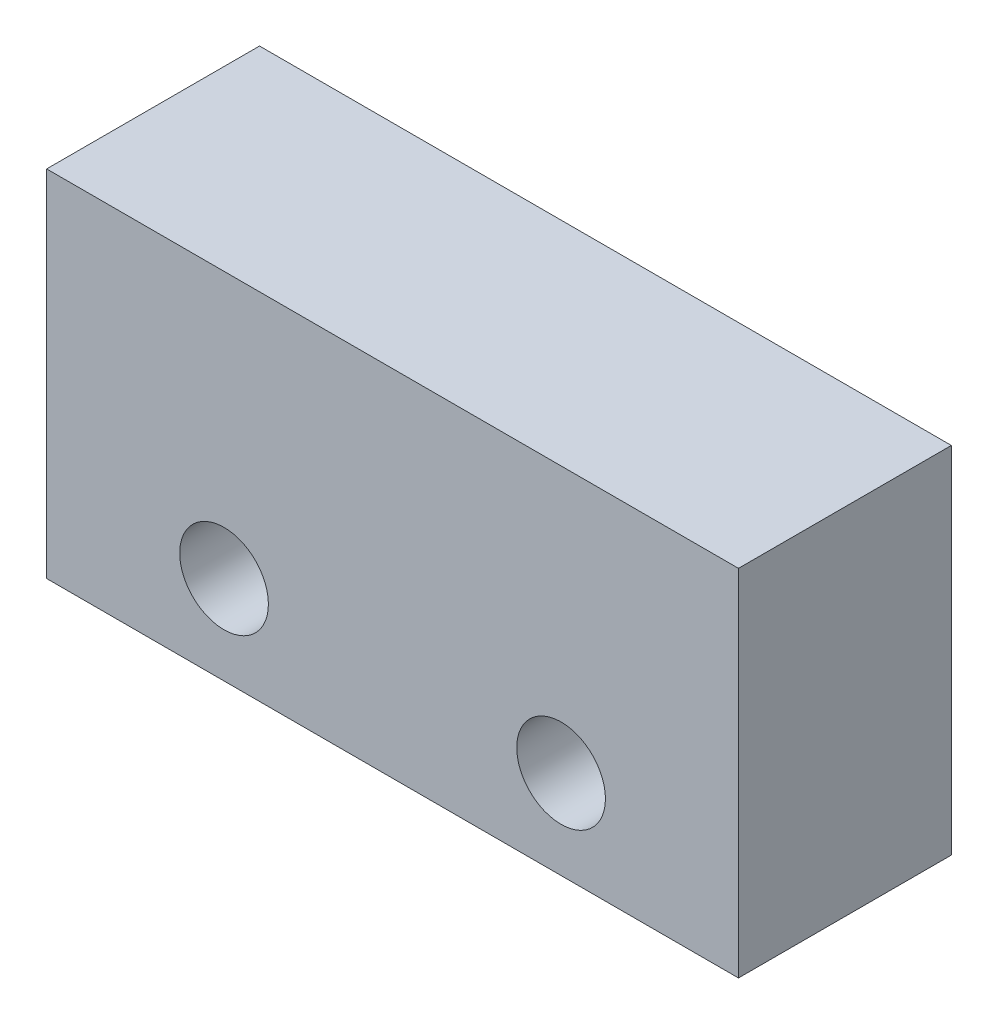
ISO-10303-21;
HEADER;
FILE_DESCRIPTION(('STEP AP214'),'2;1');
FILE_NAME('part.step','',(''),(''),'','','');
FILE_SCHEMA(('AUTOMOTIVE_DESIGN { 1 0 10303 214 1 1 1 1 }'));
ENDSEC;
DATA;
#1=APPLICATION_CONTEXT('core data for automotive mechanical design processes');
#2=APPLICATION_PROTOCOL_DEFINITION('international standard','automotive_design',2000,#1);
#3=PRODUCT_CONTEXT('',#1,'mechanical');
#4=PRODUCT('Part','Part','',(#3));
#5=PRODUCT_RELATED_PRODUCT_CATEGORY('part','',(#4));
#6=PRODUCT_DEFINITION_FORMATION('','',#4);
#7=PRODUCT_DEFINITION_CONTEXT('part definition',#1,'design');
#8=PRODUCT_DEFINITION('design','',#6,#7);
#9=PRODUCT_DEFINITION_SHAPE('','',#8);
#10=(LENGTH_UNIT() NAMED_UNIT(*) SI_UNIT(.MILLI.,.METRE.));
#11=(NAMED_UNIT(*) PLANE_ANGLE_UNIT() SI_UNIT($,.RADIAN.));
#12=(NAMED_UNIT(*) SI_UNIT($,.STERADIAN.) SOLID_ANGLE_UNIT());
#13=UNCERTAINTY_MEASURE_WITH_UNIT(LENGTH_MEASURE(1.E-05),#10,'distance_accuracy_value','');
#14=(GEOMETRIC_REPRESENTATION_CONTEXT(3) GLOBAL_UNCERTAINTY_ASSIGNED_CONTEXT((#13)) GLOBAL_UNIT_ASSIGNED_CONTEXT((#10,
#11,#12)) REPRESENTATION_CONTEXT('',''));
#15=CARTESIAN_POINT('',(0.,0.,0.));
#16=DIRECTION('',(0.,0.,1.));
#17=DIRECTION('',(1.,0.,0.));
#18=AXIS2_PLACEMENT_3D('',#15,#16,#17);
#19=CARTESIAN_POINT('',(0.,0.,3.));
#20=DIRECTION('',(0.,0.,-1.));
#21=DIRECTION('',(-1.,0.,0.));
#22=AXIS2_PLACEMENT_3D('',#19,#20,#21);
#23=PLANE('',#22);
#24=DIRECTION('',(0.,1.,0.));
#25=VECTOR('',#24,1.);
#26=CARTESIAN_POINT('',(9.75,-5.,3.));
#27=LINE('',#26,#25);
#28=CARTESIAN_POINT('',(9.75,-5.,3.));
#29=VERTEX_POINT('',#28);
#30=CARTESIAN_POINT('',(9.75,5.,3.));
#31=VERTEX_POINT('',#30);
#32=EDGE_CURVE('E98',#29,#31,#27,.T.);
#33=ORIENTED_EDGE('',*,*,#32,.T.);
#34=DIRECTION('',(-1.,0.,0.));
#35=VECTOR('',#34,1.);
#36=CARTESIAN_POINT('',(-9.75,5.,3.));
#37=LINE('',#36,#35);
#38=CARTESIAN_POINT('',(-9.75,5.,3.));
#39=VERTEX_POINT('',#38);
#40=EDGE_CURVE('E93',#31,#39,#37,.T.);
#41=ORIENTED_EDGE('',*,*,#40,.T.);
#42=DIRECTION('',(0.,-1.,0.));
#43=VECTOR('',#42,1.);
#44=CARTESIAN_POINT('',(-9.75,-5.,3.));
#45=LINE('',#44,#43);
#46=CARTESIAN_POINT('',(-9.75,-5.,3.));
#47=VERTEX_POINT('',#46);
#48=EDGE_CURVE('E96',#39,#47,#45,.T.);
#49=ORIENTED_EDGE('',*,*,#48,.T.);
#50=DIRECTION('',(1.,0.,0.));
#51=VECTOR('',#50,1.);
#52=CARTESIAN_POINT('',(-9.75,-5.,3.));
#53=LINE('',#52,#51);
#54=EDGE_CURVE('E63',#47,#29,#53,.T.);
#55=ORIENTED_EDGE('',*,*,#54,.T.);
#56=EDGE_LOOP('',(#33,#41,#49,#55));
#57=FACE_BOUND('',#56,.T.);
#58=CARTESIAN_POINT('',(-4.75,-2.5,3.));
#59=DIRECTION('',(0.,0.,1.));
#60=DIRECTION('',(1.,0.,0.));
#61=AXIS2_PLACEMENT_3D('',#58,#59,#60);
#62=CIRCLE('',#61,1.25);
#63=CARTESIAN_POINT('',(-3.5,-2.5,3.));
#64=VERTEX_POINT('',#63);
#65=EDGE_CURVE('E118',#64,#64,#62,.T.);
#66=ORIENTED_EDGE('',*,*,#65,.F.);
#67=EDGE_LOOP('',(#66));
#68=FACE_BOUND('',#67,.T.);
#69=CARTESIAN_POINT('',(4.75,-2.5,3.));
#70=DIRECTION('',(0.,0.,1.));
#71=DIRECTION('',(1.,0.,0.));
#72=AXIS2_PLACEMENT_3D('',#69,#70,#71);
#73=CIRCLE('',#72,1.25);
#74=CARTESIAN_POINT('',(6.,-2.5,3.));
#75=VERTEX_POINT('',#74);
#76=EDGE_CURVE('E140',#75,#75,#73,.T.);
#77=ORIENTED_EDGE('',*,*,#76,.F.);
#78=EDGE_LOOP('',(#77));
#79=FACE_BOUND('',#78,.T.);
#80=ADVANCED_FACE('F45',(#57,#68,#79),#23,.F.);
#81=CARTESIAN_POINT('',(0.,0.,-3.));
#82=DIRECTION('',(0.,0.,-1.));
#83=DIRECTION('',(-1.,0.,0.));
#84=AXIS2_PLACEMENT_3D('',#81,#82,#83);
#85=PLANE('',#84);
#86=CARTESIAN_POINT('',(-4.75,-2.5,-3.));
#87=DIRECTION('',(0.,0.,1.));
#88=DIRECTION('',(1.,0.,0.));
#89=AXIS2_PLACEMENT_3D('',#86,#87,#88);
#90=CIRCLE('',#89,1.25);
#91=CARTESIAN_POINT('',(-3.5,-2.5,-3.));
#92=VERTEX_POINT('',#91);
#93=EDGE_CURVE('E136',#92,#92,#90,.T.);
#94=ORIENTED_EDGE('',*,*,#93,.T.);
#95=EDGE_LOOP('',(#94));
#96=FACE_BOUND('',#95,.T.);
#97=DIRECTION('',(0.,1.,0.));
#98=VECTOR('',#97,1.);
#99=CARTESIAN_POINT('',(9.75,-5.,-3.));
#100=LINE('',#99,#98);
#101=CARTESIAN_POINT('',(9.75,-5.,-3.));
#102=VERTEX_POINT('',#101);
#103=CARTESIAN_POINT('',(9.75,5.,-3.));
#104=VERTEX_POINT('',#103);
#105=EDGE_CURVE('E114',#102,#104,#100,.T.);
#106=ORIENTED_EDGE('',*,*,#105,.F.);
#107=DIRECTION('',(1.,0.,0.));
#108=VECTOR('',#107,1.);
#109=CARTESIAN_POINT('',(-9.75,-5.,-3.));
#110=LINE('',#109,#108);
#111=CARTESIAN_POINT('',(-9.75,-5.,-3.));
#112=VERTEX_POINT('',#111);
#113=EDGE_CURVE('E86',#112,#102,#110,.T.);
#114=ORIENTED_EDGE('',*,*,#113,.F.);
#115=DIRECTION('',(0.,-1.,0.));
#116=VECTOR('',#115,1.);
#117=CARTESIAN_POINT('',(-9.75,-5.,-3.));
#118=LINE('',#117,#116);
#119=CARTESIAN_POINT('',(-9.75,5.,-3.));
#120=VERTEX_POINT('',#119);
#121=EDGE_CURVE('E80',#120,#112,#118,.T.);
#122=ORIENTED_EDGE('',*,*,#121,.F.);
#123=DIRECTION('',(-1.,0.,0.));
#124=VECTOR('',#123,1.);
#125=CARTESIAN_POINT('',(-9.75,5.,-3.));
#126=LINE('',#125,#124);
#127=EDGE_CURVE('E103',#104,#120,#126,.T.);
#128=ORIENTED_EDGE('',*,*,#127,.F.);
#129=EDGE_LOOP('',(#106,#114,#122,#128));
#130=FACE_BOUND('',#129,.T.);
#131=CARTESIAN_POINT('',(4.75,-2.5,-3.));
#132=DIRECTION('',(0.,0.,1.));
#133=DIRECTION('',(1.,0.,0.));
#134=AXIS2_PLACEMENT_3D('',#131,#132,#133);
#135=CIRCLE('',#134,1.25);
#136=CARTESIAN_POINT('',(6.,-2.5,-3.));
#137=VERTEX_POINT('',#136);
#138=EDGE_CURVE('E144',#137,#137,#135,.T.);
#139=ORIENTED_EDGE('',*,*,#138,.T.);
#140=EDGE_LOOP('',(#139));
#141=FACE_BOUND('',#140,.T.);
#142=ADVANCED_FACE('F131',(#96,#130,#141),#85,.T.);
#143=CARTESIAN_POINT('',(9.75,-5.,3.));
#144=DIRECTION('',(-1.,0.,0.));
#145=DIRECTION('',(0.,0.,1.));
#146=AXIS2_PLACEMENT_3D('',#143,#144,#145);
#147=PLANE('',#146);
#148=ORIENTED_EDGE('',*,*,#105,.T.);
#149=DIRECTION('',(0.,0.,-1.));
#150=VECTOR('',#149,1.);
#151=CARTESIAN_POINT('',(9.75,5.,3.));
#152=LINE('',#151,#150);
#153=EDGE_CURVE('E11',#31,#104,#152,.T.);
#154=ORIENTED_EDGE('',*,*,#153,.F.);
#155=ORIENTED_EDGE('',*,*,#32,.F.);
#156=DIRECTION('',(0.,0.,-1.));
#157=VECTOR('',#156,1.);
#158=CARTESIAN_POINT('',(9.75,-5.,3.));
#159=LINE('',#158,#157);
#160=EDGE_CURVE('E110',#29,#102,#159,.T.);
#161=ORIENTED_EDGE('',*,*,#160,.T.);
#162=EDGE_LOOP('',(#148,#154,#155,#161));
#163=FACE_BOUND('',#162,.T.);
#164=ADVANCED_FACE('F47',(#163),#147,.F.);
#165=CARTESIAN_POINT('',(-9.75,5.,3.));
#166=DIRECTION('',(0.,-1.,0.));
#167=DIRECTION('',(0.,0.,-1.));
#168=AXIS2_PLACEMENT_3D('',#165,#166,#167);
#169=PLANE('',#168);
#170=ORIENTED_EDGE('',*,*,#127,.T.);
#171=DIRECTION('',(0.,0.,-1.));
#172=VECTOR('',#171,1.);
#173=CARTESIAN_POINT('',(-9.75,5.,3.));
#174=LINE('',#173,#172);
#175=EDGE_CURVE('E55',#39,#120,#174,.T.);
#176=ORIENTED_EDGE('',*,*,#175,.F.);
#177=ORIENTED_EDGE('',*,*,#40,.F.);
#178=ORIENTED_EDGE('',*,*,#153,.T.);
#179=EDGE_LOOP('',(#170,#176,#177,#178));
#180=FACE_BOUND('',#179,.T.);
#181=ADVANCED_FACE('F102',(#180),#169,.F.);
#182=CARTESIAN_POINT('',(-9.75,-5.,3.));
#183=DIRECTION('',(1.,0.,0.));
#184=DIRECTION('',(0.,0.,-1.));
#185=AXIS2_PLACEMENT_3D('',#182,#183,#184);
#186=PLANE('',#185);
#187=ORIENTED_EDGE('',*,*,#121,.T.);
#188=DIRECTION('',(0.,0.,-1.));
#189=VECTOR('',#188,1.);
#190=CARTESIAN_POINT('',(-9.75,-5.,3.));
#191=LINE('',#190,#189);
#192=EDGE_CURVE('E105',#47,#112,#191,.T.);
#193=ORIENTED_EDGE('',*,*,#192,.F.);
#194=ORIENTED_EDGE('',*,*,#48,.F.);
#195=ORIENTED_EDGE('',*,*,#175,.T.);
#196=EDGE_LOOP('',(#187,#193,#194,#195));
#197=FACE_BOUND('',#196,.T.);
#198=ADVANCED_FACE('F106',(#197),#186,.F.);
#199=CARTESIAN_POINT('',(-9.75,-5.,3.));
#200=DIRECTION('',(0.,1.,0.));
#201=DIRECTION('',(0.,0.,1.));
#202=AXIS2_PLACEMENT_3D('',#199,#200,#201);
#203=PLANE('',#202);
#204=ORIENTED_EDGE('',*,*,#113,.T.);
#205=ORIENTED_EDGE('',*,*,#160,.F.);
#206=ORIENTED_EDGE('',*,*,#54,.F.);
#207=ORIENTED_EDGE('',*,*,#192,.T.);
#208=EDGE_LOOP('',(#204,#205,#206,#207));
#209=FACE_BOUND('',#208,.T.);
#210=ADVANCED_FACE('F128',(#209),#203,.F.);
#211=CARTESIAN_POINT('',(-4.75,-2.5,3.));
#212=DIRECTION('',(0.,0.,-1.));
#213=DIRECTION('',(-1.,0.,0.));
#214=AXIS2_PLACEMENT_3D('',#211,#212,#213);
#215=CYLINDRICAL_SURFACE('',#214,1.25);
#216=ORIENTED_EDGE('',*,*,#65,.T.);
#217=EDGE_LOOP('',(#216));
#218=FACE_BOUND('',#217,.T.);
#219=ORIENTED_EDGE('',*,*,#93,.F.);
#220=EDGE_LOOP('',(#219));
#221=FACE_BOUND('',#220,.T.);
#222=ADVANCED_FACE('F163',(#218,#221),#215,.F.);
#223=CARTESIAN_POINT('',(4.75,-2.5,3.));
#224=DIRECTION('',(0.,0.,-1.));
#225=DIRECTION('',(-1.,0.,0.));
#226=AXIS2_PLACEMENT_3D('',#223,#224,#225);
#227=CYLINDRICAL_SURFACE('',#226,1.25);
#228=ORIENTED_EDGE('',*,*,#76,.T.);
#229=EDGE_LOOP('',(#228));
#230=FACE_BOUND('',#229,.T.);
#231=ORIENTED_EDGE('',*,*,#138,.F.);
#232=EDGE_LOOP('',(#231));
#233=FACE_BOUND('',#232,.T.);
#234=ADVANCED_FACE('F152',(#230,#233),#227,.F.);
#235=CLOSED_SHELL('',(#80,#142,#164,#181,#198,#210,#222,#234));
#236=MANIFOLD_SOLID_BREP('B2',#235);
#237=ADVANCED_BREP_SHAPE_REPRESENTATION('',(#18,#236),#14);
#238=SHAPE_DEFINITION_REPRESENTATION(#9,#237);
ENDSEC;
END-ISO-10303-21;
